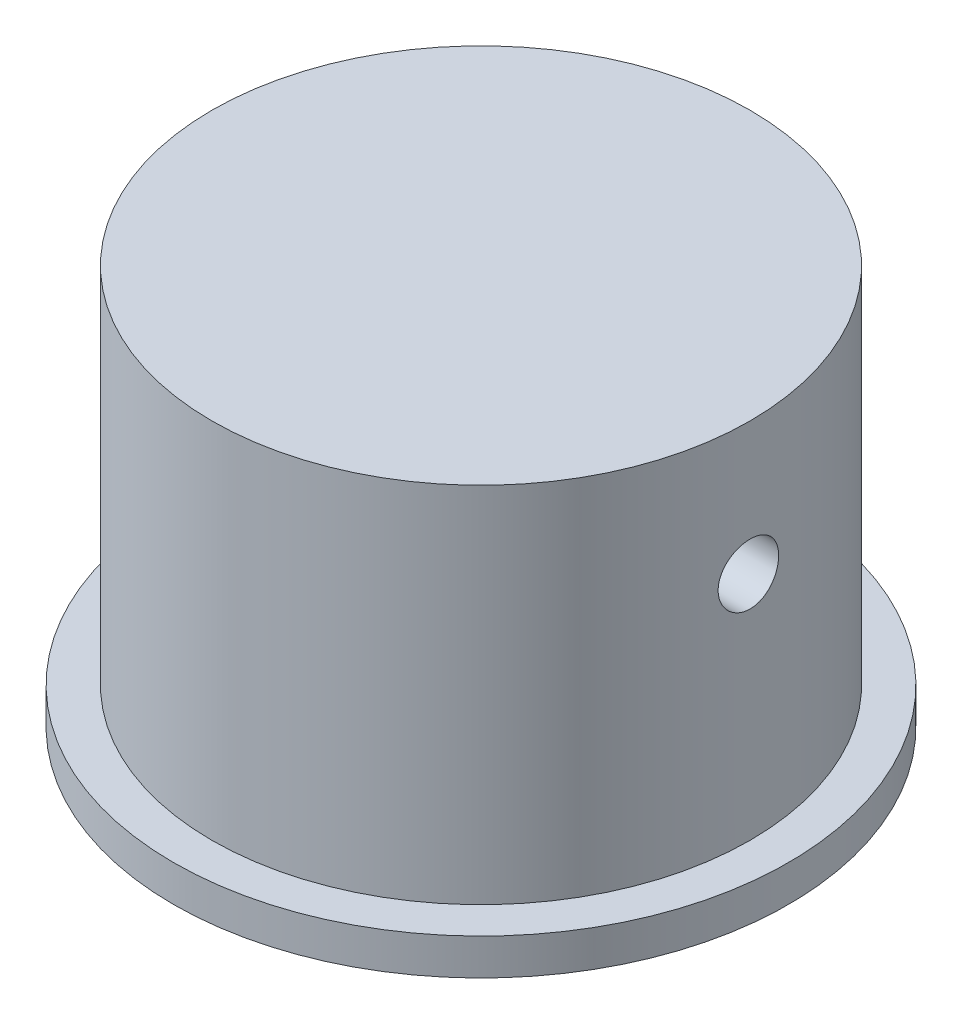
ISO-10303-21;
HEADER;
FILE_DESCRIPTION(('STEP AP214'),'2;1');
FILE_NAME('part.step','',(''),(''),'','','');
FILE_SCHEMA(('AUTOMOTIVE_DESIGN { 1 0 10303 214 1 1 1 1 }'));
ENDSEC;
DATA;
#1=APPLICATION_CONTEXT('core data for automotive mechanical design processes');
#2=APPLICATION_PROTOCOL_DEFINITION('international standard','automotive_design',2000,#1);
#3=PRODUCT_CONTEXT('',#1,'mechanical');
#4=PRODUCT('Part','Part','',(#3));
#5=PRODUCT_RELATED_PRODUCT_CATEGORY('part','',(#4));
#6=PRODUCT_DEFINITION_FORMATION('','',#4);
#7=PRODUCT_DEFINITION_CONTEXT('part definition',#1,'design');
#8=PRODUCT_DEFINITION('design','',#6,#7);
#9=PRODUCT_DEFINITION_SHAPE('','',#8);
#10=(LENGTH_UNIT() NAMED_UNIT(*) SI_UNIT(.MILLI.,.METRE.));
#11=(NAMED_UNIT(*) PLANE_ANGLE_UNIT() SI_UNIT($,.RADIAN.));
#12=(NAMED_UNIT(*) SI_UNIT($,.STERADIAN.) SOLID_ANGLE_UNIT());
#13=UNCERTAINTY_MEASURE_WITH_UNIT(LENGTH_MEASURE(1.E-05),#10,'distance_accuracy_value','');
#14=(GEOMETRIC_REPRESENTATION_CONTEXT(3) GLOBAL_UNCERTAINTY_ASSIGNED_CONTEXT((#13)) GLOBAL_UNIT_ASSIGNED_CONTEXT((#10,
#11,#12)) REPRESENTATION_CONTEXT('',''));
#15=CARTESIAN_POINT('',(0.,0.,0.));
#16=DIRECTION('',(0.,0.,1.));
#17=DIRECTION('',(1.,0.,0.));
#18=AXIS2_PLACEMENT_3D('',#15,#16,#17);
#19=CARTESIAN_POINT('',(0.,4.99999999999999,2.8067));
#20=DIRECTION('',(0.,1.,0.));
#21=DIRECTION('',(0.,0.,1.));
#22=AXIS2_PLACEMENT_3D('',#19,#20,#21);
#23=PLANE('',#22);
#24=CARTESIAN_POINT('',(0.,4.99999999999989,0.));
#25=DIRECTION('',(0.,-1.,0.));
#26=DIRECTION('',(0.,0.,-1.));
#27=AXIS2_PLACEMENT_3D('',#24,#25,#26);
#28=CIRCLE('',#27,2.80669999999998);
#29=CARTESIAN_POINT('',(0.,4.9999999999999,-2.80669999999997));
#30=VERTEX_POINT('',#29);
#31=EDGE_CURVE('E101',#30,#30,#28,.T.);
#32=ORIENTED_EDGE('',*,*,#31,.T.);
#33=EDGE_LOOP('',(#32));
#34=FACE_BOUND('',#33,.T.);
#35=ADVANCED_FACE('F44',(#34),#23,.F.);
#36=CARTESIAN_POINT('',(0.,-1000.,-3.43024899888577E-12));
#37=DIRECTION('',(0.,-1.,0.));
#38=DIRECTION('',(0.,0.,-1.));
#39=AXIS2_PLACEMENT_3D('',#36,#37,#38);
#40=CYLINDRICAL_SURFACE('',#39,2.80669999999999);
#41=ORIENTED_EDGE('',*,*,#31,.F.);
#42=EDGE_LOOP('',(#41));
#43=FACE_BOUND('',#42,.T.);
#44=CARTESIAN_POINT('',(0.,0.,0.));
#45=DIRECTION('',(0.,-1.,0.));
#46=DIRECTION('',(0.,0.,-1.));
#47=AXIS2_PLACEMENT_3D('',#44,#45,#46);
#48=CIRCLE('',#47,2.8067);
#49=CARTESIAN_POINT('',(0.,0.,-2.8067));
#50=VERTEX_POINT('',#49);
#51=EDGE_CURVE('E97',#50,#50,#48,.T.);
#52=ORIENTED_EDGE('',*,*,#51,.T.);
#53=EDGE_LOOP('',(#52));
#54=FACE_BOUND('',#53,.T.);
#55=ADVANCED_FACE('F131',(#43,#54),#40,.F.);
#56=CARTESIAN_POINT('',(0.,0.,12.7));
#57=DIRECTION('',(0.,1.,0.));
#58=DIRECTION('',(0.,0.,1.));
#59=AXIS2_PLACEMENT_3D('',#56,#57,#58);
#60=PLANE('',#59);
#61=ORIENTED_EDGE('',*,*,#51,.F.);
#62=EDGE_LOOP('',(#61));
#63=FACE_BOUND('',#62,.T.);
#64=CARTESIAN_POINT('',(0.,0.,0.));
#65=DIRECTION('',(0.,-1.,0.));
#66=DIRECTION('',(0.,0.,-1.));
#67=AXIS2_PLACEMENT_3D('',#64,#65,#66);
#68=CIRCLE('',#67,12.7);
#69=CARTESIAN_POINT('',(0.,0.,-12.7));
#70=VERTEX_POINT('',#69);
#71=EDGE_CURVE('E93',#70,#70,#68,.T.);
#72=ORIENTED_EDGE('',*,*,#71,.T.);
#73=EDGE_LOOP('',(#72));
#74=FACE_BOUND('',#73,.T.);
#75=ADVANCED_FACE('F136',(#63,#74),#60,.F.);
#76=CARTESIAN_POINT('',(0.,-1000.,-3.43024899888577E-12));
#77=DIRECTION('',(0.,-1.,0.));
#78=DIRECTION('',(0.,0.,-1.));
#79=AXIS2_PLACEMENT_3D('',#76,#77,#78);
#80=CYLINDRICAL_SURFACE('',#79,12.7);
#81=ORIENTED_EDGE('',*,*,#71,.F.);
#82=EDGE_LOOP('',(#81));
#83=FACE_BOUND('',#82,.T.);
#84=CARTESIAN_POINT('',(0.,1.50000000000006,0.));
#85=DIRECTION('',(0.,-1.,0.));
#86=DIRECTION('',(0.,0.,-1.));
#87=AXIS2_PLACEMENT_3D('',#84,#85,#86);
#88=CIRCLE('',#87,12.7);
#89=CARTESIAN_POINT('',(0.,1.5000000000001,-12.7));
#90=VERTEX_POINT('',#89);
#91=EDGE_CURVE('E89',#90,#90,#88,.T.);
#92=ORIENTED_EDGE('',*,*,#91,.T.);
#93=EDGE_LOOP('',(#92));
#94=FACE_BOUND('',#93,.T.);
#95=ADVANCED_FACE('F144',(#83,#94),#80,.T.);
#96=CARTESIAN_POINT('',(0.,1.5,12.7));
#97=DIRECTION('',(0.,-1.,0.));
#98=DIRECTION('',(0.,0.,-1.));
#99=AXIS2_PLACEMENT_3D('',#96,#97,#98);
#100=PLANE('',#99);
#101=ORIENTED_EDGE('',*,*,#91,.F.);
#102=EDGE_LOOP('',(#101));
#103=FACE_BOUND('',#102,.T.);
#104=CARTESIAN_POINT('',(0.,1.50000000000006,0.));
#105=DIRECTION('',(0.,-1.,0.));
#106=DIRECTION('',(0.,0.,-1.));
#107=AXIS2_PLACEMENT_3D('',#104,#105,#106);
#108=CIRCLE('',#107,11.1125);
#109=CARTESIAN_POINT('',(0.,1.5000000000001,-11.1125));
#110=VERTEX_POINT('',#109);
#111=EDGE_CURVE('E85',#110,#110,#108,.T.);
#112=ORIENTED_EDGE('',*,*,#111,.T.);
#113=EDGE_LOOP('',(#112));
#114=FACE_BOUND('',#113,.T.);
#115=ADVANCED_FACE('F127',(#103,#114),#100,.F.);
#116=CARTESIAN_POINT('',(0.,-1000.,-3.43024899888577E-12));
#117=DIRECTION('',(0.,-1.,0.));
#118=DIRECTION('',(0.,0.,-1.));
#119=AXIS2_PLACEMENT_3D('',#116,#117,#118);
#120=CYLINDRICAL_SURFACE('',#119,11.1125);
#121=CARTESIAN_POINT('',(-11.0419724800418,11.0250000000001,1.24999999999999));
#122=CARTESIAN_POINT('',(-11.0419733947566,10.9550256676867,1.24999699392726));
#123=CARTESIAN_POINT('',(-11.0426448089234,10.8850062615081,1.24410450454351));
#124=CARTESIAN_POINT('',(-11.0452572457342,10.746912220168,1.22068917049601));
#125=CARTESIAN_POINT('',(-11.0471996333108,10.6788397580047,1.20315382195271));
#126=CARTESIAN_POINT('',(-11.0521312832992,10.5466592037446,1.15697287850946));
#127=CARTESIAN_POINT('',(-11.0551198751634,10.4825486032495,1.12833439871903));
#128=CARTESIAN_POINT('',(-11.0618063784944,10.360056719415,1.06077457365559));
#129=CARTESIAN_POINT('',(-11.0655041583334,10.3016743759256,1.0218551360597));
#130=CARTESIAN_POINT('',(-11.0732112798684,10.1920170602535,0.934647798379217));
#131=CARTESIAN_POINT('',(-11.0772218270776,10.1407719474151,0.88632245483904));
#132=CARTESIAN_POINT('',(-11.0850917061214,10.0471012737561,0.78175543890342));
#133=CARTESIAN_POINT('',(-11.0889510307497,10.0046761328135,0.725513389843929));
#134=CARTESIAN_POINT('',(-11.0960957657832,9.92974441898379,0.606524008915577));
#135=CARTESIAN_POINT('',(-11.0993796187844,9.89726458914254,0.543759734559988));
#136=CARTESIAN_POINT('',(-11.1049902211234,9.84331665581568,0.413624730471362));
#137=CARTESIAN_POINT('',(-11.107316999528,9.82184821790504,0.346254140706346));
#138=CARTESIAN_POINT('',(-11.110742810194,9.790620922226,0.209122665594843));
#139=CARTESIAN_POINT('',(-11.1118470182206,9.7808126877431,0.139373155570353));
#140=CARTESIAN_POINT('',(-11.1127209129854,9.77303132179625,-0.000790071085205184));
#141=CARTESIAN_POINT('',(-11.1124906427846,9.77505780844856,-0.0712037662110954));
#142=CARTESIAN_POINT('',(-11.1107257388973,9.79084852124377,-0.210361030999151));
#143=CARTESIAN_POINT('',(-11.1091970058826,9.80455964920308,-0.279110711241802));
#144=CARTESIAN_POINT('',(-11.1050136507891,9.84324758202943,-0.413326940599768));
#145=CARTESIAN_POINT('',(-11.1023590108206,9.86822456590087,-0.478793437529861));
#146=CARTESIAN_POINT('',(-11.0962120397215,9.92879259548004,-0.604750910043653));
#147=CARTESIAN_POINT('',(-11.0927178768156,9.96440689289339,-0.665230611769424));
#148=CARTESIAN_POINT('',(-11.0852833970703,10.0452216943195,-0.779374696925243));
#149=CARTESIAN_POINT('',(-11.08134306366,10.0904225544325,-0.833038827067168));
#150=CARTESIAN_POINT('',(-11.0734321122458,10.1894254451572,-0.932339897971833));
#151=CARTESIAN_POINT('',(-11.0694614473486,10.243273707643,-0.977930754405867));
#152=CARTESIAN_POINT('',(-11.0619590028532,10.3578832576387,-1.05943368543983));
#153=CARTESIAN_POINT('',(-11.0584272242021,10.4186445600664,-1.09534573915284));
#154=CARTESIAN_POINT('',(-11.0522023097766,10.5453934764444,-1.15647277355034));
#155=CARTESIAN_POINT('',(-11.0495094284497,10.6113826684779,-1.18168450953999));
#156=CARTESIAN_POINT('',(-11.0452723469832,10.7466948677527,-1.22065670356135));
#157=CARTESIAN_POINT('',(-11.0437281023082,10.8160177456286,-1.23441760556992));
#158=CARTESIAN_POINT('',(-11.0419710780835,10.9556237730409,-1.25003740563723));
#159=CARTESIAN_POINT('',(-11.0417510660911,11.0258996015271,-1.25196095599194));
#160=CARTESIAN_POINT('',(-11.0426483145691,11.1657725370181,-1.24402161709721));
#161=CARTESIAN_POINT('',(-11.0437655520706,11.23536965566,-1.2341589302922));
#162=CARTESIAN_POINT('',(-11.04720482793,11.3717186194472,-1.20298133806102));
#163=CARTESIAN_POINT('',(-11.0495236131703,11.4384776231708,-1.18169734960795));
#164=CARTESIAN_POINT('',(-11.0551020820381,11.5674785051603,-1.12831301416258));
#165=CARTESIAN_POINT('',(-11.0583617927049,11.629720253549,-1.09621235632615));
#166=CARTESIAN_POINT('',(-11.065472252698,11.7482134714056,-1.02194536018745));
#167=CARTESIAN_POINT('',(-11.0693254799837,11.8044380693125,-0.979736389244406));
#168=CARTESIAN_POINT('',(-11.077180865841,11.9090276870955,-0.886511632128001));
#169=CARTESIAN_POINT('',(-11.0811830290848,11.9573924601522,-0.835495569492213));
#170=CARTESIAN_POINT('',(-11.0889073661693,12.0451144474763,-0.725823384521296));
#171=CARTESIAN_POINT('',(-11.0926281719389,12.0844293398152,-0.667133300782245));
#172=CARTESIAN_POINT('',(-11.0993503999015,12.1526435742026,-0.543945585491989));
#173=CARTESIAN_POINT('',(-11.1023518341855,12.1815430913118,-0.479448051574825));
#174=CARTESIAN_POINT('',(-11.1072910159584,12.2280353705699,-0.34662065470774));
#175=CARTESIAN_POINT('',(-11.1092311176306,12.2456531720739,-0.278299647168023));
#176=CARTESIAN_POINT('',(-11.1118387555901,12.2691635168817,-0.139646150604177));
#177=CARTESIAN_POINT('',(-11.1125063378189,12.275056483485,-0.0693137342905392));
#178=CARTESIAN_POINT('',(-11.1124936050723,12.2749430095926,0.07095158260929));
#179=CARTESIAN_POINT('',(-11.1118207082911,12.2690020578694,0.140884545987485));
#180=CARTESIAN_POINT('',(-11.1092173025523,12.2455273655994,0.278751869089146));
#181=CARTESIAN_POINT('',(-11.1072867934018,12.2279936232734,0.346686228505874));
#182=CARTESIAN_POINT('',(-11.1023842701231,12.1818503867461,0.478623560908594));
#183=CARTESIAN_POINT('',(-11.0994124914885,12.1532433967179,0.542627418973587));
#184=CARTESIAN_POINT('',(-11.0927576539738,12.0857725381141,0.664935928041619));
#185=CARTESIAN_POINT('',(-11.089074593234,12.0469086427221,0.723240564143576));
#186=CARTESIAN_POINT('',(-11.0813847365188,11.9597829246247,0.832830851006333));
#187=CARTESIAN_POINT('',(-11.0773763257231,11.9114723062869,0.884077596811186));
#188=CARTESIAN_POINT('',(-11.0695009017166,11.8069239068204,0.977763985080953));
#189=CARTESIAN_POINT('',(-11.0656339224377,11.7506842388796,1.02020152533016));
#190=CARTESIAN_POINT('',(-11.0584661932843,11.6316749271106,1.09517529992391));
#191=CARTESIAN_POINT('',(-11.0551672662543,11.5688852629893,1.12767990940156));
#192=CARTESIAN_POINT('',(-11.0495306549817,11.4387394973174,1.18163921888809));
#193=CARTESIAN_POINT('',(-11.0471919053385,11.3713885541384,1.20310617285292));
#194=CARTESIAN_POINT('',(-11.0443199634252,11.2572260177866,1.22912794799706));
#195=CARTESIAN_POINT('',(-11.0434439234859,11.2111399413839,1.23694401002717));
#196=CARTESIAN_POINT('',(-11.0422698782179,11.1183759325607,1.24738102430578));
#197=CARTESIAN_POINT('',(-11.0419718695985,11.0716980035111,1.25000200612982));
#198=CARTESIAN_POINT('',(-11.0419724800418,11.0250000000001,1.24999999999999));
#199=B_SPLINE_CURVE_WITH_KNOTS('',3,(#121,#122,#123,#124,#125,#126,#127,#128,#129,#130,#131,
#132,#133,#134,#135,#136,#137,#138,#139,#140,#141,#142,#143,#144,#145,#146,#147,#148,#149,#150,
#151,#152,#153,#154,#155,#156,#157,#158,#159,#160,#161,#162,#163,#164,#165,#166,#167,#168,#169,
#170,#171,#172,#173,#174,#175,#176,#177,#178,#179,#180,#181,#182,#183,#184,#185,#186,#187,#188,
#189,#190,#191,#192,#193,#194,#195,#196,#197,#198),.UNSPECIFIED.,.T.,.F.,(4,2,2,2,2,2,2,2,2,2,2,
2,2,2,2,2,2,2,2,2,2,2,2,2,2,2,2,2,2,2,2,2,2,2,2,2,2,2,4),(0.,0.20975243552277,0.419730500381616,
0.629574228895927,0.839379047297272,1.05003680964448,1.26070459813735,1.47193399797107,
1.68315698221439,1.89348229126625,2.10380081356156,2.31316865679264,2.52253982680922,
2.73237204509744,2.94221205913192,3.15321377542156,3.36421594705042,3.57528205597226,
3.78633998096306,3.9962441361969,4.20614468609696,4.4154798894991,4.62482110918624,
4.83506129341689,5.045308078474,5.25651896819923,5.46772630773927,5.67846324054371,
5.88919256501618,6.09875895553358,6.30832537821424,6.51784443590262,6.72736404138113,
6.93799592660588,7.14867801907108,7.36002406400367,7.57113496410509,7.71111594584655,
7.85109613067516),.UNSPECIFIED.);
#200=CARTESIAN_POINT('',(-11.0419724800418,11.0250000000001,1.24999999999999));
#201=VERTEX_POINT('',#200);
#202=EDGE_CURVE('E11',#201,#201,#199,.T.);
#203=ORIENTED_EDGE('',*,*,#202,.T.);
#204=EDGE_LOOP('',(#203));
#205=FACE_BOUND('',#204,.T.);
#206=CARTESIAN_POINT('',(11.0419724800417,11.0250000000001,-1.24999999999999));
#207=CARTESIAN_POINT('',(11.0419733947566,10.9550256676867,-1.24999699392726));
#208=CARTESIAN_POINT('',(11.0426448089234,10.8850062615081,-1.24410450454351));
#209=CARTESIAN_POINT('',(11.0452572457342,10.746912220168,-1.22068917049601));
#210=CARTESIAN_POINT('',(11.0471996333108,10.6788397580047,-1.20315382195271));
#211=CARTESIAN_POINT('',(11.0521312832992,10.5466592037446,-1.15697287850946));
#212=CARTESIAN_POINT('',(11.0551198751634,10.4825486032495,-1.12833439871903));
#213=CARTESIAN_POINT('',(11.0618063784944,10.360056719415,-1.06077457365559));
#214=CARTESIAN_POINT('',(11.0655041583334,10.3016743759256,-1.0218551360597));
#215=CARTESIAN_POINT('',(11.0732112798684,10.1920170602535,-0.934647798379217));
#216=CARTESIAN_POINT('',(11.0772218270776,10.1407719474151,-0.886322454839039));
#217=CARTESIAN_POINT('',(11.0850917061214,10.0471012737561,-0.78175543890342));
#218=CARTESIAN_POINT('',(11.0889510307497,10.0046761328135,-0.72551338984393));
#219=CARTESIAN_POINT('',(11.0960957657832,9.92974441898379,-0.606524008915579));
#220=CARTESIAN_POINT('',(11.0993796187844,9.89726458914254,-0.543759734559989));
#221=CARTESIAN_POINT('',(11.1049902211234,9.84331665581568,-0.413624730471363));
#222=CARTESIAN_POINT('',(11.107316999528,9.82184821790504,-0.346254140706347));
#223=CARTESIAN_POINT('',(11.110742810194,9.790620922226,-0.209122665594843));
#224=CARTESIAN_POINT('',(11.1118470182206,9.7808126877431,-0.139373155570354));
#225=CARTESIAN_POINT('',(11.1127209129854,9.77303132179625,0.000790071085204981));
#226=CARTESIAN_POINT('',(11.1124906427846,9.77505780844856,0.0712037662110952));
#227=CARTESIAN_POINT('',(11.1107257388973,9.79084852124377,0.210361030999151));
#228=CARTESIAN_POINT('',(11.1091970058826,9.80455964920308,0.279110711241802));
#229=CARTESIAN_POINT('',(11.1050136507891,9.84324758202943,0.413326940599768));
#230=CARTESIAN_POINT('',(11.1023590108206,9.86822456590087,0.478793437529861));
#231=CARTESIAN_POINT('',(11.0962120397215,9.92879259548004,0.604750910043653));
#232=CARTESIAN_POINT('',(11.0927178768156,9.96440689289339,0.665230611769424));
#233=CARTESIAN_POINT('',(11.0852833970703,10.0452216943195,0.779374696925243));
#234=CARTESIAN_POINT('',(11.08134306366,10.0904225544325,0.833038827067168));
#235=CARTESIAN_POINT('',(11.0734321122458,10.1894254451572,0.932339897971833));
#236=CARTESIAN_POINT('',(11.0694614473486,10.243273707643,0.977930754405867));
#237=CARTESIAN_POINT('',(11.0619590028532,10.3578832576386,1.05943368543983));
#238=CARTESIAN_POINT('',(11.0584272242021,10.4186445600664,1.09534573915284));
#239=CARTESIAN_POINT('',(11.0522023097766,10.5453934764444,1.15647277355034));
#240=CARTESIAN_POINT('',(11.0495094284497,10.6113826684779,1.18168450953999));
#241=CARTESIAN_POINT('',(11.0452723469832,10.7466948677527,1.22065670356135));
#242=CARTESIAN_POINT('',(11.0437281023082,10.8160177456286,1.23441760556992));
#243=CARTESIAN_POINT('',(11.0419710780835,10.9556237730409,1.25003740563723));
#244=CARTESIAN_POINT('',(11.0417510660911,11.0258996015271,1.25196095599194));
#245=CARTESIAN_POINT('',(11.0426483145691,11.1657725370181,1.24402161709721));
#246=CARTESIAN_POINT('',(11.0437655520706,11.23536965566,1.2341589302922));
#247=CARTESIAN_POINT('',(11.04720482793,11.3717186194472,1.20298133806102));
#248=CARTESIAN_POINT('',(11.0495236131703,11.4384776231708,1.18169734960795));
#249=CARTESIAN_POINT('',(11.0551020820381,11.5674785051603,1.12831301416258));
#250=CARTESIAN_POINT('',(11.0583617927049,11.629720253549,1.09621235632615));
#251=CARTESIAN_POINT('',(11.065472252698,11.7482134714056,1.02194536018745));
#252=CARTESIAN_POINT('',(11.0693254799837,11.8044380693125,0.979736389244406));
#253=CARTESIAN_POINT('',(11.077180865841,11.9090276870955,0.886511632128001));
#254=CARTESIAN_POINT('',(11.0811830290848,11.9573924601522,0.835495569492213));
#255=CARTESIAN_POINT('',(11.0889073661694,12.0451144474763,0.725823384521296));
#256=CARTESIAN_POINT('',(11.0926281719389,12.0844293398153,0.667133300782244));
#257=CARTESIAN_POINT('',(11.0993503999015,12.1526435742026,0.543945585491989));
#258=CARTESIAN_POINT('',(11.1023518341855,12.1815430913118,0.479448051574824));
#259=CARTESIAN_POINT('',(11.1072910159584,12.2280353705699,0.346620654707739));
#260=CARTESIAN_POINT('',(11.1092311176306,12.2456531720739,0.278299647168022));
#261=CARTESIAN_POINT('',(11.1118387555901,12.2691635168817,0.139646150604177));
#262=CARTESIAN_POINT('',(11.1125063378189,12.275056483485,0.0693137342905388));
#263=CARTESIAN_POINT('',(11.1124936050723,12.2749430095926,-0.0709515826092901));
#264=CARTESIAN_POINT('',(11.1118207082911,12.2690020578694,-0.140884545987485));
#265=CARTESIAN_POINT('',(11.1092173025523,12.2455273655994,-0.278751869089146));
#266=CARTESIAN_POINT('',(11.1072867934018,12.2279936232734,-0.346686228505873));
#267=CARTESIAN_POINT('',(11.1023842701231,12.1818503867461,-0.478623560908595));
#268=CARTESIAN_POINT('',(11.0994124914885,12.1532433967179,-0.542627418973587));
#269=CARTESIAN_POINT('',(11.0927576539738,12.0857725381141,-0.66493592804162));
#270=CARTESIAN_POINT('',(11.089074593234,12.0469086427221,-0.723240564143577));
#271=CARTESIAN_POINT('',(11.0813847365188,11.9597829246247,-0.832830851006334));
#272=CARTESIAN_POINT('',(11.0773763257231,11.9114723062869,-0.884077596811187));
#273=CARTESIAN_POINT('',(11.0695009017166,11.8069239068204,-0.977763985080954));
#274=CARTESIAN_POINT('',(11.0656339224377,11.7506842388796,-1.02020152533016));
#275=CARTESIAN_POINT('',(11.0584661932843,11.6316749271106,-1.09517529992391));
#276=CARTESIAN_POINT('',(11.0551672662543,11.5688852629893,-1.12767990940156));
#277=CARTESIAN_POINT('',(11.0495306549816,11.4387394973174,-1.18163921888809));
#278=CARTESIAN_POINT('',(11.0471919053385,11.3713885541384,-1.20310617285292));
#279=CARTESIAN_POINT('',(11.0443199634252,11.2572260177866,-1.22912794799706));
#280=CARTESIAN_POINT('',(11.0434439234859,11.2111399413839,-1.23694401002717));
#281=CARTESIAN_POINT('',(11.0422698782179,11.1183759325607,-1.24738102430578));
#282=CARTESIAN_POINT('',(11.0419718695985,11.0716980035111,-1.25000200612982));
#283=CARTESIAN_POINT('',(11.0419724800417,11.0250000000001,-1.24999999999999));
#284=B_SPLINE_CURVE_WITH_KNOTS('',3,(#206,#207,#208,#209,#210,#211,#212,#213,#214,#215,#216,
#217,#218,#219,#220,#221,#222,#223,#224,#225,#226,#227,#228,#229,#230,#231,#232,#233,#234,#235,
#236,#237,#238,#239,#240,#241,#242,#243,#244,#245,#246,#247,#248,#249,#250,#251,#252,#253,#254,
#255,#256,#257,#258,#259,#260,#261,#262,#263,#264,#265,#266,#267,#268,#269,#270,#271,#272,#273,
#274,#275,#276,#277,#278,#279,#280,#281,#282,#283),.UNSPECIFIED.,.T.,.F.,(4,2,2,2,2,2,2,2,2,2,2,
2,2,2,2,2,2,2,2,2,2,2,2,2,2,2,2,2,2,2,2,2,2,2,2,2,2,2,4),(0.,0.209752435522768,
0.419730500381616,0.629574228895925,0.839379047297274,1.05003680964448,1.26070459813735,
1.47193399797107,1.68315698221439,1.89348229126625,2.10380081356156,2.31316865679264,
2.52253982680922,2.73237204509744,2.94221205913192,3.15321377542156,3.36421594705042,
3.57528205597226,3.78633998096306,3.9962441361969,4.20614468609696,4.4154798894991,
4.62482110918624,4.83506129341689,5.045308078474,5.25651896819923,5.46772630773927,
5.67846324054371,5.88919256501618,6.09875895553358,6.30832537821424,6.51784443590262,
6.72736404138113,6.93799592660589,7.14867801907108,7.36002406400367,7.57113496410509,
7.71111594584655,7.85109613067516),.UNSPECIFIED.);
#285=CARTESIAN_POINT('',(11.0419724800417,11.0250000000001,-1.24999999999999));
#286=VERTEX_POINT('',#285);
#287=EDGE_CURVE('E57',#286,#286,#284,.T.);
#288=ORIENTED_EDGE('',*,*,#287,.T.);
#289=EDGE_LOOP('',(#288));
#290=FACE_BOUND('',#289,.T.);
#291=ORIENTED_EDGE('',*,*,#111,.F.);
#292=EDGE_LOOP('',(#291));
#293=FACE_BOUND('',#292,.T.);
#294=CARTESIAN_POINT('',(0.,16.5,0.));
#295=DIRECTION('',(0.,-1.,0.));
#296=DIRECTION('',(0.,0.,-1.));
#297=AXIS2_PLACEMENT_3D('',#294,#295,#296);
#298=CIRCLE('',#297,11.1124999999999);
#299=CARTESIAN_POINT('',(0.,16.5,-11.1124999999999));
#300=VERTEX_POINT('',#299);
#301=EDGE_CURVE('E79',#300,#300,#298,.T.);
#302=ORIENTED_EDGE('',*,*,#301,.T.);
#303=EDGE_LOOP('',(#302));
#304=FACE_BOUND('',#303,.T.);
#305=ADVANCED_FACE('F110',(#205,#290,#293,#304),#120,.T.);
#306=CARTESIAN_POINT('',(0.,16.5,11.1125));
#307=DIRECTION('',(0.,-1.,0.));
#308=DIRECTION('',(0.,0.,-1.));
#309=AXIS2_PLACEMENT_3D('',#306,#307,#308);
#310=PLANE('',#309);
#311=ORIENTED_EDGE('',*,*,#301,.F.);
#312=EDGE_LOOP('',(#311));
#313=FACE_BOUND('',#312,.T.);
#314=ADVANCED_FACE('F119',(#313),#310,.F.);
#315=CARTESIAN_POINT('',(11.1125,11.0250000000001,0.));
#316=DIRECTION('',(1.,0.,0.));
#317=DIRECTION('',(0.,0.,-1.));
#318=AXIS2_PLACEMENT_3D('',#315,#316,#317);
#319=CYLINDRICAL_SURFACE('',#318,1.24999999999999);
#320=CARTESIAN_POINT('',(1.11249999999997,11.0250000000001,0.));
#321=DIRECTION('',(1.,0.,0.));
#322=DIRECTION('',(0.,0.,-1.));
#323=AXIS2_PLACEMENT_3D('',#320,#321,#322);
#324=CIRCLE('',#323,1.25);
#325=CARTESIAN_POINT('',(1.11249999999997,11.0250000000001,-1.25));
#326=VERTEX_POINT('',#325);
#327=EDGE_CURVE('E75',#326,#326,#324,.T.);
#328=ORIENTED_EDGE('',*,*,#327,.F.);
#329=EDGE_LOOP('',(#328));
#330=FACE_BOUND('',#329,.T.);
#331=ORIENTED_EDGE('',*,*,#287,.F.);
#332=EDGE_LOOP('',(#331));
#333=FACE_BOUND('',#332,.T.);
#334=ADVANCED_FACE('F114',(#330,#333),#319,.F.);
#335=CARTESIAN_POINT('',(1.11249999999997,11.0250000000001,0.));
#336=DIRECTION('',(1.,0.,0.));
#337=DIRECTION('',(0.,0.,-1.));
#338=AXIS2_PLACEMENT_3D('',#335,#336,#337);
#339=CONICAL_SURFACE('',#338,1.25,1.02974425867665);
#340=CARTESIAN_POINT('',(0.361424226215518,11.0250000000001,0.));
#341=VERTEX_POINT('',#340);
#342=VERTEX_LOOP('',#341);
#343=FACE_BOUND('',#342,.T.);
#344=ORIENTED_EDGE('',*,*,#327,.T.);
#345=EDGE_LOOP('',(#344));
#346=FACE_BOUND('',#345,.T.);
#347=ADVANCED_FACE('F118',(#343,#346),#339,.F.);
#348=CARTESIAN_POINT('',(-11.1125,11.0250000000001,0.));
#349=DIRECTION('',(-1.,0.,0.));
#350=DIRECTION('',(0.,0.,1.));
#351=AXIS2_PLACEMENT_3D('',#348,#349,#350);
#352=CYLINDRICAL_SURFACE('',#351,1.24999999999999);
#353=CARTESIAN_POINT('',(-1.11249999999997,11.0250000000001,0.));
#354=DIRECTION('',(-1.,0.,0.));
#355=DIRECTION('',(0.,0.,1.));
#356=AXIS2_PLACEMENT_3D('',#353,#354,#355);
#357=CIRCLE('',#356,1.25);
#358=CARTESIAN_POINT('',(-1.11249999999997,11.0250000000001,1.25));
#359=VERTEX_POINT('',#358);
#360=EDGE_CURVE('E72',#359,#359,#357,.T.);
#361=ORIENTED_EDGE('',*,*,#360,.F.);
#362=EDGE_LOOP('',(#361));
#363=FACE_BOUND('',#362,.T.);
#364=ORIENTED_EDGE('',*,*,#202,.F.);
#365=EDGE_LOOP('',(#364));
#366=FACE_BOUND('',#365,.T.);
#367=ADVANCED_FACE('F68',(#363,#366),#352,.F.);
#368=CARTESIAN_POINT('',(-1.11249999999997,11.0250000000001,0.));
#369=DIRECTION('',(-1.,0.,0.));
#370=DIRECTION('',(0.,0.,1.));
#371=AXIS2_PLACEMENT_3D('',#368,#369,#370);
#372=CONICAL_SURFACE('',#371,1.25,1.02974425867665);
#373=CARTESIAN_POINT('',(-0.361424226215518,11.0250000000001,0.));
#374=VERTEX_POINT('',#373);
#375=VERTEX_LOOP('',#374);
#376=FACE_BOUND('',#375,.T.);
#377=ORIENTED_EDGE('',*,*,#360,.T.);
#378=EDGE_LOOP('',(#377));
#379=FACE_BOUND('',#378,.T.);
#380=ADVANCED_FACE('F65',(#376,#379),#372,.F.);
#381=CLOSED_SHELL('',(#35,#55,#75,#95,#115,#305,#314,#334,#347,#367,#380));
#382=MANIFOLD_SOLID_BREP('B2',#381);
#383=ADVANCED_BREP_SHAPE_REPRESENTATION('',(#18,#382),#14);
#384=SHAPE_DEFINITION_REPRESENTATION(#9,#383);
ENDSEC;
END-ISO-10303-21;
